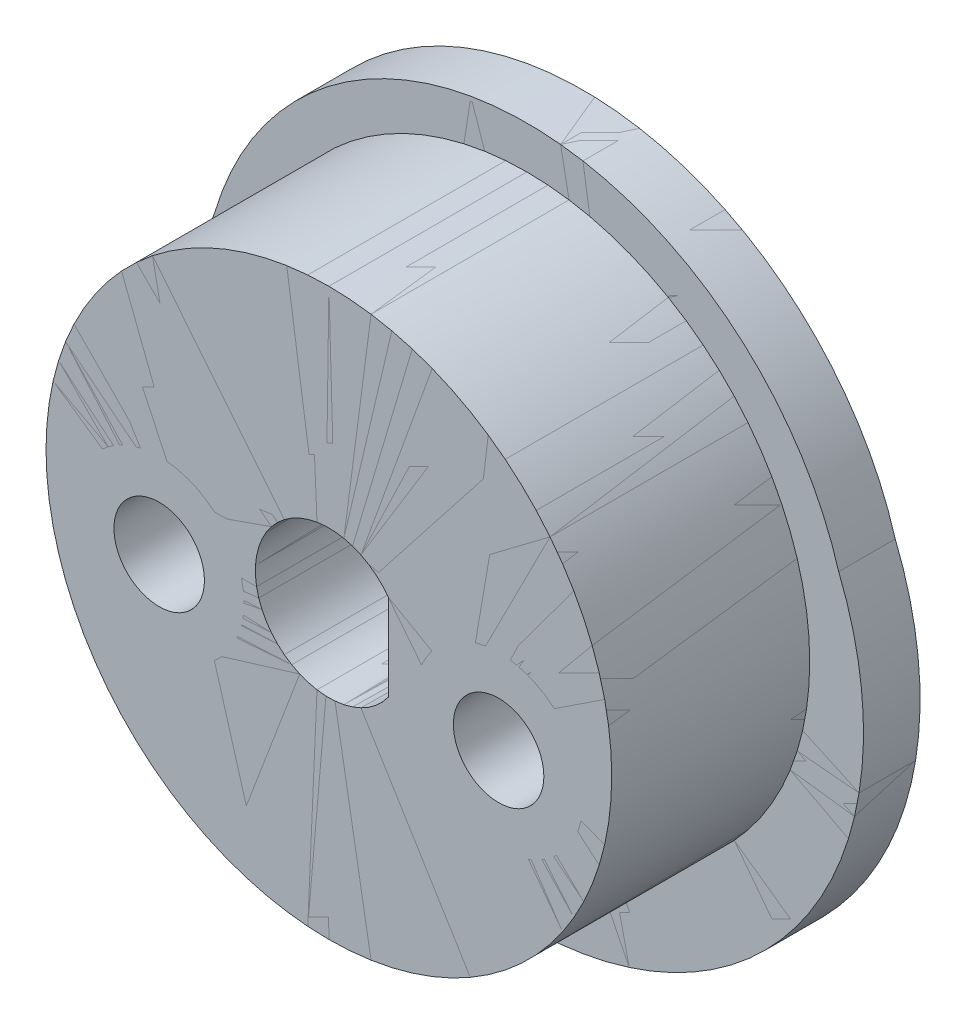
ISO-10303-21;
HEADER;
FILE_DESCRIPTION(('STEP AP214'),'2;1');
FILE_NAME('part.step','',(''),(''),'','','');
FILE_SCHEMA(('AUTOMOTIVE_DESIGN { 1 0 10303 214 1 1 1 1 }'));
ENDSEC;
DATA;
#1=APPLICATION_CONTEXT('core data for automotive mechanical design processes');
#2=APPLICATION_PROTOCOL_DEFINITION('international standard','automotive_design',2000,#1);
#3=PRODUCT_CONTEXT('',#1,'mechanical');
#4=PRODUCT('Part','Part','',(#3));
#5=PRODUCT_RELATED_PRODUCT_CATEGORY('part','',(#4));
#6=PRODUCT_DEFINITION_FORMATION('','',#4);
#7=PRODUCT_DEFINITION_CONTEXT('part definition',#1,'design');
#8=PRODUCT_DEFINITION('design','',#6,#7);
#9=PRODUCT_DEFINITION_SHAPE('','',#8);
#10=(LENGTH_UNIT() NAMED_UNIT(*) SI_UNIT(.MILLI.,.METRE.));
#11=(NAMED_UNIT(*) PLANE_ANGLE_UNIT() SI_UNIT($,.RADIAN.));
#12=(NAMED_UNIT(*) SI_UNIT($,.STERADIAN.) SOLID_ANGLE_UNIT());
#13=UNCERTAINTY_MEASURE_WITH_UNIT(LENGTH_MEASURE(1.E-05),#10,'distance_accuracy_value','');
#14=(GEOMETRIC_REPRESENTATION_CONTEXT(3) GLOBAL_UNCERTAINTY_ASSIGNED_CONTEXT((#13)) GLOBAL_UNIT_ASSIGNED_CONTEXT((#10,
#11,#12)) REPRESENTATION_CONTEXT('',''));
#15=CARTESIAN_POINT('',(0.,0.,0.));
#16=DIRECTION('',(0.,0.,1.));
#17=DIRECTION('',(1.,0.,0.));
#18=AXIS2_PLACEMENT_3D('',#15,#16,#17);
#19=CARTESIAN_POINT('',(0.,0.,18.));
#20=DIRECTION('',(0.,0.,1.));
#21=DIRECTION('',(1.,0.,0.));
#22=AXIS2_PLACEMENT_3D('',#19,#20,#21);
#23=PLANE('',#22);
#24=CARTESIAN_POINT('',(6.,-1.21,18.));
#25=DIRECTION('',(0.,0.,1.));
#26=DIRECTION('',(1.,0.,0.));
#27=AXIS2_PLACEMENT_3D('',#24,#25,#26);
#28=CIRCLE('',#27,3.);
#29=CARTESIAN_POINT('',(9.,-1.21,18.));
#30=VERTEX_POINT('',#29);
#31=EDGE_CURVE('P0_E60',#30,#30,#28,.F.);
#32=ORIENTED_EDGE('',*,*,#31,.T.);
#33=EDGE_LOOP('',(#32));
#34=FACE_BOUND('',#33,.T.);
#35=CARTESIAN_POINT('',(-6.,-1.21,18.));
#36=DIRECTION('',(0.,0.,1.));
#37=DIRECTION('',(1.,0.,0.));
#38=AXIS2_PLACEMENT_3D('',#35,#36,#37);
#39=CIRCLE('',#38,3.);
#40=CARTESIAN_POINT('',(-3.,-1.21,18.));
#41=VERTEX_POINT('',#40);
#42=EDGE_CURVE('P0_E140',#41,#41,#39,.F.);
#43=ORIENTED_EDGE('',*,*,#42,.T.);
#44=EDGE_LOOP('',(#43));
#45=FACE_BOUND('',#44,.T.);
#46=CARTESIAN_POINT('',(-1.59872115546023E-13,-2.8421709430404E-13,18.));
#47=DIRECTION('',(0.,0.,-1.));
#48=DIRECTION('',(-1.,0.,0.));
#49=AXIS2_PLACEMENT_3D('',#46,#47,#48);
#50=CIRCLE('',#49,2.6);
#51=CARTESIAN_POINT('',(2.09999999999983,-1.53297097167589,18.));
#52=VERTEX_POINT('',#51);
#53=CARTESIAN_POINT('',(2.09999999999983,1.53297097167532,18.));
#54=VERTEX_POINT('',#53);
#55=EDGE_CURVE('P0_E105',#52,#54,#50,.T.);
#56=ORIENTED_EDGE('',*,*,#55,.T.);
#57=DIRECTION('',(0.,1.,0.));
#58=VECTOR('',#57,1.);
#59=CARTESIAN_POINT('',(2.09999999999983,0.,18.));
#60=LINE('',#59,#58);
#61=EDGE_CURVE('P0_E112',#54,#52,#60,.F.);
#62=ORIENTED_EDGE('',*,*,#61,.T.);
#63=EDGE_LOOP('',(#56,#62));
#64=FACE_BOUND('',#63,.T.);
#65=CARTESIAN_POINT('',(0.,0.,18.));
#66=DIRECTION('',(0.,0.,1.));
#67=DIRECTION('',(-1.,0.,0.));
#68=AXIS2_PLACEMENT_3D('',#65,#66,#67);
#69=CIRCLE('',#68,10.);
#70=CARTESIAN_POINT('',(10.,0.,18.));
#71=VERTEX_POINT('',#70);
#72=EDGE_CURVE('P0_E176',#71,#71,#69,.T.);
#73=ORIENTED_EDGE('',*,*,#72,.T.);
#74=EDGE_LOOP('',(#73));
#75=FACE_BOUND('',#74,.T.);
#76=ADVANCED_FACE('P0_F49',(#34,#45,#64,#75),#23,.T.);
#77=CARTESIAN_POINT('',(0.,0.,11.));
#78=DIRECTION('',(0.,0.,1.));
#79=DIRECTION('',(-1.,0.,0.));
#80=AXIS2_PLACEMENT_3D('',#77,#78,#79);
#81=CYLINDRICAL_SURFACE('',#80,10.);
#82=ORIENTED_EDGE('',*,*,#72,.F.);
#83=DIRECTION('',(0.,0.,-1.));
#84=VECTOR('',#83,1.);
#85=CARTESIAN_POINT('',(10.,0.,11.));
#86=LINE('',#85,#84);
#87=CARTESIAN_POINT('',(10.,0.,11.));
#88=VERTEX_POINT('',#87);
#89=EDGE_CURVE('P0_E72',#71,#88,#86,.T.);
#90=ORIENTED_EDGE('',*,*,#89,.T.);
#91=CARTESIAN_POINT('',(0.,0.,11.));
#92=DIRECTION('',(0.,0.,-1.));
#93=DIRECTION('',(-1.,0.,0.));
#94=AXIS2_PLACEMENT_3D('',#91,#92,#93);
#95=CIRCLE('',#94,10.);
#96=EDGE_CURVE('P0_E187',#88,#88,#95,.T.);
#97=ORIENTED_EDGE('',*,*,#96,.F.);
#98=ORIENTED_EDGE('',*,*,#89,.F.);
#99=EDGE_LOOP('',(#82,#90,#97,#98));
#100=FACE_BOUND('',#99,.T.);
#101=ADVANCED_FACE('P0_F220',(#100),#81,.T.);
#102=CARTESIAN_POINT('',(0.,0.,9.));
#103=DIRECTION('',(0.,0.,1.));
#104=DIRECTION('',(1.,0.,0.));
#105=AXIS2_PLACEMENT_3D('',#102,#103,#104);
#106=PLANE('',#105);
#107=CARTESIAN_POINT('',(-6.,-1.21,9.));
#108=DIRECTION('',(0.,0.,1.));
#109=DIRECTION('',(1.,0.,0.));
#110=AXIS2_PLACEMENT_3D('',#107,#108,#109);
#111=CIRCLE('',#110,2.);
#112=CARTESIAN_POINT('',(-4.,-1.21,9.));
#113=VERTEX_POINT('',#112);
#114=EDGE_CURVE('P0_E166',#113,#113,#111,.T.);
#115=ORIENTED_EDGE('',*,*,#114,.T.);
#116=EDGE_LOOP('',(#115));
#117=FACE_BOUND('',#116,.T.);
#118=CARTESIAN_POINT('',(6.,-1.21,9.));
#119=DIRECTION('',(0.,0.,1.));
#120=DIRECTION('',(1.,0.,0.));
#121=AXIS2_PLACEMENT_3D('',#118,#119,#120);
#122=CIRCLE('',#121,2.);
#123=CARTESIAN_POINT('',(8.,-1.21,9.));
#124=VERTEX_POINT('',#123);
#125=EDGE_CURVE('P0_E163',#124,#124,#122,.T.);
#126=ORIENTED_EDGE('',*,*,#125,.T.);
#127=EDGE_LOOP('',(#126));
#128=FACE_BOUND('',#127,.T.);
#129=CARTESIAN_POINT('',(-1.5487611193521E-13,-2.81469292318093E-13,9.));
#130=DIRECTION('',(0.,0.,1.));
#131=DIRECTION('',(-1.,0.,0.));
#132=AXIS2_PLACEMENT_3D('',#129,#130,#131);
#133=CIRCLE('',#132,2.6);
#134=CARTESIAN_POINT('',(2.09999999999984,1.53297097167533,9.));
#135=VERTEX_POINT('',#134);
#136=CARTESIAN_POINT('',(2.09999999999984,-1.5329709716759,9.));
#137=VERTEX_POINT('',#136);
#138=EDGE_CURVE('P0_E116',#135,#137,#133,.T.);
#139=ORIENTED_EDGE('',*,*,#138,.T.);
#140=DIRECTION('',(0.,1.,0.));
#141=VECTOR('',#140,1.);
#142=CARTESIAN_POINT('',(2.09999999999984,0.766485485837665,9.));
#143=LINE('',#142,#141);
#144=EDGE_CURVE('P0_E133',#137,#135,#143,.T.);
#145=ORIENTED_EDGE('',*,*,#144,.T.);
#146=EDGE_LOOP('',(#139,#145));
#147=FACE_BOUND('',#146,.T.);
#148=CARTESIAN_POINT('',(0.,0.,9.));
#149=DIRECTION('',(0.,0.,-1.));
#150=DIRECTION('',(-1.,0.,0.));
#151=AXIS2_PLACEMENT_3D('',#148,#149,#150);
#152=CIRCLE('',#151,11.5);
#153=CARTESIAN_POINT('',(-11.0242322682793,3.27357646848657,9.));
#154=VERTEX_POINT('',#153);
#155=CARTESIAN_POINT('',(11.0242322682793,3.27357646848657,9.));
#156=VERTEX_POINT('',#155);
#157=EDGE_CURVE('P0_E179',#154,#156,#152,.T.);
#158=ORIENTED_EDGE('',*,*,#157,.T.);
#159=CARTESIAN_POINT('',(0.,-1.21,9.));
#160=DIRECTION('',(0.,0.,1.));
#161=DIRECTION('',(-1.,0.,0.));
#162=AXIS2_PLACEMENT_3D('',#159,#160,#161);
#163=CIRCLE('',#162,11.9010989010989);
#164=EDGE_CURVE('P0_E175',#154,#156,#163,.T.);
#165=ORIENTED_EDGE('',*,*,#164,.F.);
#166=EDGE_LOOP('',(#158,#165));
#167=FACE_BOUND('',#166,.T.);
#168=ADVANCED_FACE('P0_F218',(#117,#128,#147,#167),#106,.F.);
#169=CARTESIAN_POINT('',(0.,0.,9.));
#170=DIRECTION('',(0.,0.,1.));
#171=DIRECTION('',(-1.,0.,0.));
#172=AXIS2_PLACEMENT_3D('',#169,#170,#171);
#173=CYLINDRICAL_SURFACE('',#172,11.5);
#174=DIRECTION('',(0.,0.,1.));
#175=VECTOR('',#174,1.);
#176=CARTESIAN_POINT('',(-11.0242322682793,3.27357646848657,9.));
#177=LINE('',#176,#175);
#178=CARTESIAN_POINT('',(-11.0242322682793,3.27357646848657,11.));
#179=VERTEX_POINT('',#178);
#180=EDGE_CURVE('P0_E115',#154,#179,#177,.T.);
#181=ORIENTED_EDGE('',*,*,#180,.T.);
#182=CARTESIAN_POINT('',(0.,0.,11.));
#183=DIRECTION('',(0.,0.,1.));
#184=DIRECTION('',(-1.,0.,0.));
#185=AXIS2_PLACEMENT_3D('',#182,#183,#184);
#186=CIRCLE('',#185,11.5);
#187=CARTESIAN_POINT('',(11.0242322682793,3.27357646848657,11.));
#188=VERTEX_POINT('',#187);
#189=EDGE_CURVE('P0_E188',#188,#179,#186,.T.);
#190=ORIENTED_EDGE('',*,*,#189,.F.);
#191=DIRECTION('',(0.,0.,-1.));
#192=VECTOR('',#191,1.);
#193=CARTESIAN_POINT('',(11.0242322682793,3.27357646848657,9.));
#194=LINE('',#193,#192);
#195=EDGE_CURVE('P0_E183',#188,#156,#194,.T.);
#196=ORIENTED_EDGE('',*,*,#195,.T.);
#197=ORIENTED_EDGE('',*,*,#157,.F.);
#198=EDGE_LOOP('',(#181,#190,#196,#197));
#199=FACE_BOUND('',#198,.T.);
#200=ADVANCED_FACE('P0_F214',(#199),#173,.T.);
#201=CARTESIAN_POINT('',(0.,0.,11.));
#202=DIRECTION('',(0.,0.,1.));
#203=DIRECTION('',(1.,0.,0.));
#204=AXIS2_PLACEMENT_3D('',#201,#202,#203);
#205=PLANE('',#204);
#206=ORIENTED_EDGE('',*,*,#96,.T.);
#207=EDGE_LOOP('',(#206));
#208=FACE_BOUND('',#207,.T.);
#209=ORIENTED_EDGE('',*,*,#189,.T.);
#210=CARTESIAN_POINT('',(0.,-1.21,11.));
#211=DIRECTION('',(0.,0.,1.));
#212=DIRECTION('',(-1.,0.,0.));
#213=AXIS2_PLACEMENT_3D('',#210,#211,#212);
#214=CIRCLE('',#213,11.9010989010989);
#215=EDGE_CURVE('P0_E192',#179,#188,#214,.T.);
#216=ORIENTED_EDGE('',*,*,#215,.T.);
#217=EDGE_LOOP('',(#209,#216));
#218=FACE_BOUND('',#217,.T.);
#219=ADVANCED_FACE('P0_F208',(#208,#218),#205,.T.);
#220=CARTESIAN_POINT('',(0.,-1.21,9.));
#221=DIRECTION('',(0.,0.,1.));
#222=DIRECTION('',(0.,-1.,0.));
#223=AXIS2_PLACEMENT_3D('',#220,#221,#222);
#224=CYLINDRICAL_SURFACE('',#223,11.9010989010989);
#225=ORIENTED_EDGE('',*,*,#180,.F.);
#226=ORIENTED_EDGE('',*,*,#164,.T.);
#227=ORIENTED_EDGE('',*,*,#195,.F.);
#228=ORIENTED_EDGE('',*,*,#215,.F.);
#229=EDGE_LOOP('',(#225,#226,#227,#228));
#230=FACE_BOUND('',#229,.T.);
#231=ADVANCED_FACE('P0_F211',(#230),#224,.T.);
#232=CARTESIAN_POINT('',(-1.59872115546023E-13,-2.8421709430404E-13,17.9999999999996));
#233=DIRECTION('',(0.,0.,-1.));
#234=DIRECTION('',(-1.,0.,0.));
#235=AXIS2_PLACEMENT_3D('',#232,#233,#234);
#236=CYLINDRICAL_SURFACE('',#235,2.6);
#237=ORIENTED_EDGE('',*,*,#138,.F.);
#238=DIRECTION('',(0.,0.,-1.));
#239=VECTOR('',#238,1.);
#240=CARTESIAN_POINT('',(2.09999999999983,1.53297097167533,17.9999999999996));
#241=LINE('',#240,#239);
#242=EDGE_CURVE('P0_E119',#54,#135,#241,.T.);
#243=ORIENTED_EDGE('',*,*,#242,.F.);
#244=ORIENTED_EDGE('',*,*,#55,.F.);
#245=DIRECTION('',(0.,0.,-1.));
#246=VECTOR('',#245,1.);
#247=CARTESIAN_POINT('',(2.09999999999983,-1.5329709716759,17.9999999999996));
#248=LINE('',#247,#246);
#249=EDGE_CURVE('P0_E127',#52,#137,#248,.T.);
#250=ORIENTED_EDGE('',*,*,#249,.T.);
#251=EDGE_LOOP('',(#237,#243,#244,#250));
#252=FACE_BOUND('',#251,.T.);
#253=ADVANCED_FACE('P0_F120',(#252),#236,.F.);
#254=CARTESIAN_POINT('',(2.09999999999983,1.53297097167533,17.9999999999996));
#255=DIRECTION('',(1.,0.,0.));
#256=DIRECTION('',(0.,0.,1.));
#257=AXIS2_PLACEMENT_3D('',#254,#255,#256);
#258=PLANE('',#257);
#259=ORIENTED_EDGE('',*,*,#144,.F.);
#260=ORIENTED_EDGE('',*,*,#249,.F.);
#261=ORIENTED_EDGE('',*,*,#61,.F.);
#262=ORIENTED_EDGE('',*,*,#242,.T.);
#263=EDGE_LOOP('',(#259,#260,#261,#262));
#264=FACE_BOUND('',#263,.T.);
#265=ADVANCED_FACE('P0_F126',(#264),#258,.F.);
#266=CARTESIAN_POINT('',(6.,-1.21,9.));
#267=DIRECTION('',(0.,0.,1.));
#268=DIRECTION('',(1.,0.,0.));
#269=AXIS2_PLACEMENT_3D('',#266,#267,#268);
#270=CYLINDRICAL_SURFACE('',#269,2.);
#271=CARTESIAN_POINT('',(6.,-1.21,17.));
#272=DIRECTION('',(0.,0.,1.));
#273=DIRECTION('',(1.,0.,0.));
#274=AXIS2_PLACEMENT_3D('',#271,#272,#273);
#275=CIRCLE('',#274,2.);
#276=CARTESIAN_POINT('',(8.,-1.21,17.));
#277=VERTEX_POINT('',#276);
#278=EDGE_CURVE('P0_E136',#277,#277,#275,.T.);
#279=ORIENTED_EDGE('',*,*,#278,.T.);
#280=EDGE_LOOP('',(#279));
#281=FACE_BOUND('',#280,.T.);
#282=ORIENTED_EDGE('',*,*,#125,.F.);
#283=EDGE_LOOP('',(#282));
#284=FACE_BOUND('',#283,.T.);
#285=ADVANCED_FACE('P0_F157',(#281,#284),#270,.F.);
#286=CARTESIAN_POINT('',(-6.,-1.21,9.));
#287=DIRECTION('',(0.,0.,1.));
#288=DIRECTION('',(1.,0.,0.));
#289=AXIS2_PLACEMENT_3D('',#286,#287,#288);
#290=CYLINDRICAL_SURFACE('',#289,2.);
#291=CARTESIAN_POINT('',(-6.,-1.21,17.));
#292=DIRECTION('',(0.,0.,1.));
#293=DIRECTION('',(1.,0.,0.));
#294=AXIS2_PLACEMENT_3D('',#291,#292,#293);
#295=CIRCLE('',#294,2.);
#296=CARTESIAN_POINT('',(-4.,-1.21,17.));
#297=VERTEX_POINT('',#296);
#298=EDGE_CURVE('P0_E11',#297,#297,#295,.T.);
#299=ORIENTED_EDGE('',*,*,#298,.T.);
#300=EDGE_LOOP('',(#299));
#301=FACE_BOUND('',#300,.T.);
#302=ORIENTED_EDGE('',*,*,#114,.F.);
#303=EDGE_LOOP('',(#302));
#304=FACE_BOUND('',#303,.T.);
#305=ADVANCED_FACE('P0_F154',(#301,#304),#290,.F.);
#306=CARTESIAN_POINT('',(6.,-1.21,17.));
#307=DIRECTION('',(0.,0.,1.));
#308=DIRECTION('',(1.,0.,0.));
#309=AXIS2_PLACEMENT_3D('',#306,#307,#308);
#310=CONICAL_SURFACE('',#309,2.,0.785398163397449);
#311=ORIENTED_EDGE('',*,*,#31,.F.);
#312=EDGE_LOOP('',(#311));
#313=FACE_BOUND('',#312,.T.);
#314=ORIENTED_EDGE('',*,*,#278,.F.);
#315=EDGE_LOOP('',(#314));
#316=FACE_BOUND('',#315,.T.);
#317=ADVANCED_FACE('P0_F151',(#313,#316),#310,.F.);
#318=CARTESIAN_POINT('',(-6.,-1.21,17.));
#319=DIRECTION('',(0.,0.,1.));
#320=DIRECTION('',(1.,0.,0.));
#321=AXIS2_PLACEMENT_3D('',#318,#319,#320);
#322=CONICAL_SURFACE('',#321,2.,0.785398163397451);
#323=ORIENTED_EDGE('',*,*,#42,.F.);
#324=EDGE_LOOP('',(#323));
#325=FACE_BOUND('',#324,.T.);
#326=ORIENTED_EDGE('',*,*,#298,.F.);
#327=EDGE_LOOP('',(#326));
#328=FACE_BOUND('',#327,.T.);
#329=ADVANCED_FACE('P0_F52',(#325,#328),#322,.F.);
#330=CLOSED_SHELL('',(#76,#101,#168,#200,#219,#231,#253,#265,#285,#305,#317,#329));
#331=MANIFOLD_SOLID_BREP('P0_B2',#330);
#332=CARTESIAN_POINT('',(0.,0.,18.));
#333=DIRECTION('',(0.,0.,1.));
#334=DIRECTION('',(1.,0.,0.));
#335=AXIS2_PLACEMENT_3D('',#332,#333,#334);
#336=PLANE('',#335);
#337=CARTESIAN_POINT('',(-6.,-1.21,18.));
#338=DIRECTION('',(0.,0.,-1.));
#339=DIRECTION('',(-1.,0.,0.));
#340=AXIS2_PLACEMENT_3D('',#337,#338,#339);
#341=CIRCLE('',#340,1.6);
#342=CARTESIAN_POINT('',(-4.4,-1.21,18.));
#343=VERTEX_POINT('',#342);
#344=EDGE_CURVE('P1_E20',#343,#343,#341,.T.);
#345=ORIENTED_EDGE('',*,*,#344,.T.);
#346=EDGE_LOOP('',(#345));
#347=FACE_BOUND('',#346,.T.);
#348=CARTESIAN_POINT('',(6.,-1.21,18.));
#349=DIRECTION('',(0.,0.,-1.));
#350=DIRECTION('',(-1.,0.,0.));
#351=AXIS2_PLACEMENT_3D('',#348,#349,#350);
#352=CIRCLE('',#351,1.6);
#353=CARTESIAN_POINT('',(7.6,-1.21,18.));
#354=VERTEX_POINT('',#353);
#355=EDGE_CURVE('P1_E152',#354,#354,#352,.T.);
#356=ORIENTED_EDGE('',*,*,#355,.T.);
#357=EDGE_LOOP('',(#356));
#358=FACE_BOUND('',#357,.T.);
#359=CARTESIAN_POINT('',(-1.59872115546023E-13,-2.8421709430404E-13,18.));
#360=DIRECTION('',(0.,0.,-1.));
#361=DIRECTION('',(-1.,0.,0.));
#362=AXIS2_PLACEMENT_3D('',#359,#360,#361);
#363=CIRCLE('',#362,2.6);
#364=CARTESIAN_POINT('',(2.09999999999983,-1.5329709716759,17.9999999999996));
#365=VERTEX_POINT('',#364);
#366=CARTESIAN_POINT('',(2.09999999999983,1.53297097167533,17.9999999999996));
#367=VERTEX_POINT('',#366);
#368=EDGE_CURVE('P1_E99',#365,#367,#363,.T.);
#369=ORIENTED_EDGE('',*,*,#368,.T.);
#370=DIRECTION('',(0.,-1.,0.));
#371=VECTOR('',#370,1.);
#372=CARTESIAN_POINT('',(2.09999999999983,0.766485485837665,18.));
#373=LINE('',#372,#371);
#374=EDGE_CURVE('P1_E113',#367,#365,#373,.T.);
#375=ORIENTED_EDGE('',*,*,#374,.T.);
#376=EDGE_LOOP('',(#369,#375));
#377=FACE_BOUND('',#376,.T.);
#378=CARTESIAN_POINT('',(0.,0.,18.));
#379=DIRECTION('',(0.,0.,1.));
#380=DIRECTION('',(-1.,0.,0.));
#381=AXIS2_PLACEMENT_3D('',#378,#379,#380);
#382=CIRCLE('',#381,10.);
#383=CARTESIAN_POINT('',(10.,0.,18.));
#384=VERTEX_POINT('',#383);
#385=EDGE_CURVE('P1_E27',#384,#384,#382,.T.);
#386=ORIENTED_EDGE('',*,*,#385,.T.);
#387=EDGE_LOOP('',(#386));
#388=FACE_BOUND('',#387,.T.);
#389=ADVANCED_FACE('P1_F17',(#347,#358,#377,#388),#336,.T.);
#390=CARTESIAN_POINT('',(0.,0.,11.));
#391=DIRECTION('',(0.,0.,1.));
#392=DIRECTION('',(-1.,0.,0.));
#393=AXIS2_PLACEMENT_3D('',#390,#391,#392);
#394=CYLINDRICAL_SURFACE('',#393,10.);
#395=ORIENTED_EDGE('',*,*,#385,.F.);
#396=DIRECTION('',(0.,0.,-1.));
#397=VECTOR('',#396,1.);
#398=CARTESIAN_POINT('',(10.,0.,11.));
#399=LINE('',#398,#397);
#400=CARTESIAN_POINT('',(10.,0.,11.));
#401=VERTEX_POINT('',#400);
#402=EDGE_CURVE('P1_E11',#384,#401,#399,.T.);
#403=ORIENTED_EDGE('',*,*,#402,.T.);
#404=CARTESIAN_POINT('',(0.,0.,11.));
#405=DIRECTION('',(0.,0.,-1.));
#406=DIRECTION('',(-1.,0.,0.));
#407=AXIS2_PLACEMENT_3D('',#404,#405,#406);
#408=CIRCLE('',#407,10.);
#409=EDGE_CURVE('P1_E139',#401,#401,#408,.T.);
#410=ORIENTED_EDGE('',*,*,#409,.F.);
#411=ORIENTED_EDGE('',*,*,#402,.F.);
#412=EDGE_LOOP('',(#395,#403,#410,#411));
#413=FACE_BOUND('',#412,.T.);
#414=ADVANCED_FACE('P1_F204',(#413),#394,.T.);
#415=CARTESIAN_POINT('',(0.,0.,9.));
#416=DIRECTION('',(0.,0.,1.));
#417=DIRECTION('',(1.,0.,0.));
#418=AXIS2_PLACEMENT_3D('',#415,#416,#417);
#419=PLANE('',#418);
#420=CARTESIAN_POINT('',(-6.,-1.21,9.));
#421=DIRECTION('',(0.,0.,1.));
#422=DIRECTION('',(-1.,0.,0.));
#423=AXIS2_PLACEMENT_3D('',#420,#421,#422);
#424=CIRCLE('',#423,1.6);
#425=CARTESIAN_POINT('',(-4.4,-1.21,9.));
#426=VERTEX_POINT('',#425);
#427=EDGE_CURVE('P1_E157',#426,#426,#424,.T.);
#428=ORIENTED_EDGE('',*,*,#427,.T.);
#429=EDGE_LOOP('',(#428));
#430=FACE_BOUND('',#429,.T.);
#431=CARTESIAN_POINT('',(6.,-1.21,9.));
#432=DIRECTION('',(0.,0.,1.));
#433=DIRECTION('',(-1.,0.,0.));
#434=AXIS2_PLACEMENT_3D('',#431,#432,#433);
#435=CIRCLE('',#434,1.6);
#436=CARTESIAN_POINT('',(7.6,-1.21,9.));
#437=VERTEX_POINT('',#436);
#438=EDGE_CURVE('P1_E110',#437,#437,#435,.T.);
#439=ORIENTED_EDGE('',*,*,#438,.T.);
#440=EDGE_LOOP('',(#439));
#441=FACE_BOUND('',#440,.T.);
#442=CARTESIAN_POINT('',(-1.5487611193521E-13,-2.81469292318093E-13,9.));
#443=DIRECTION('',(0.,0.,1.));
#444=DIRECTION('',(-1.,0.,0.));
#445=AXIS2_PLACEMENT_3D('',#442,#443,#444);
#446=CIRCLE('',#445,2.6);
#447=CARTESIAN_POINT('',(2.09999999999984,1.53297097167533,9.));
#448=VERTEX_POINT('',#447);
#449=CARTESIAN_POINT('',(2.09999999999984,-1.5329709716759,9.));
#450=VERTEX_POINT('',#449);
#451=EDGE_CURVE('P1_E111',#448,#450,#446,.T.);
#452=ORIENTED_EDGE('',*,*,#451,.T.);
#453=DIRECTION('',(0.,1.,0.));
#454=VECTOR('',#453,1.);
#455=CARTESIAN_POINT('',(2.09999999999984,0.766485485837665,9.));
#456=LINE('',#455,#454);
#457=EDGE_CURVE('P1_E120',#450,#448,#456,.T.);
#458=ORIENTED_EDGE('',*,*,#457,.T.);
#459=EDGE_LOOP('',(#452,#458));
#460=FACE_BOUND('',#459,.T.);
#461=CARTESIAN_POINT('',(0.,0.,9.));
#462=DIRECTION('',(0.,0.,-1.));
#463=DIRECTION('',(-1.,0.,0.));
#464=AXIS2_PLACEMENT_3D('',#461,#462,#463);
#465=CIRCLE('',#464,11.5);
#466=CARTESIAN_POINT('',(-11.0242322682793,3.27357646848657,9.));
#467=VERTEX_POINT('',#466);
#468=CARTESIAN_POINT('',(11.0242322682793,3.27357646848657,9.));
#469=VERTEX_POINT('',#468);
#470=EDGE_CURVE('P1_E91',#467,#469,#465,.T.);
#471=ORIENTED_EDGE('',*,*,#470,.T.);
#472=CARTESIAN_POINT('',(0.,-1.21,9.));
#473=DIRECTION('',(0.,0.,1.));
#474=DIRECTION('',(-1.,0.,0.));
#475=AXIS2_PLACEMENT_3D('',#472,#473,#474);
#476=CIRCLE('',#475,11.9010989010989);
#477=EDGE_CURVE('P1_E132',#467,#469,#476,.T.);
#478=ORIENTED_EDGE('',*,*,#477,.F.);
#479=EDGE_LOOP('',(#471,#478));
#480=FACE_BOUND('',#479,.T.);
#481=ADVANCED_FACE('P1_F174',(#430,#441,#460,#480),#419,.F.);
#482=CARTESIAN_POINT('',(0.,0.,9.));
#483=DIRECTION('',(0.,0.,1.));
#484=DIRECTION('',(-1.,0.,0.));
#485=AXIS2_PLACEMENT_3D('',#482,#483,#484);
#486=CYLINDRICAL_SURFACE('',#485,11.5);
#487=DIRECTION('',(0.,0.,1.));
#488=VECTOR('',#487,1.);
#489=CARTESIAN_POINT('',(-11.0242322682793,3.27357646848657,9.));
#490=LINE('',#489,#488);
#491=CARTESIAN_POINT('',(-11.0242322682793,3.27357646848657,11.));
#492=VERTEX_POINT('',#491);
#493=EDGE_CURVE('P1_E128',#467,#492,#490,.T.);
#494=ORIENTED_EDGE('',*,*,#493,.T.);
#495=CARTESIAN_POINT('',(0.,0.,11.));
#496=DIRECTION('',(0.,0.,1.));
#497=DIRECTION('',(-1.,0.,0.));
#498=AXIS2_PLACEMENT_3D('',#495,#496,#497);
#499=CIRCLE('',#498,11.5);
#500=CARTESIAN_POINT('',(11.0242322682793,3.27357646848657,11.));
#501=VERTEX_POINT('',#500);
#502=EDGE_CURVE('P1_E81',#501,#492,#499,.T.);
#503=ORIENTED_EDGE('',*,*,#502,.F.);
#504=DIRECTION('',(0.,0.,-1.));
#505=VECTOR('',#504,1.);
#506=CARTESIAN_POINT('',(11.0242322682793,3.27357646848657,9.));
#507=LINE('',#506,#505);
#508=EDGE_CURVE('P1_E136',#501,#469,#507,.T.);
#509=ORIENTED_EDGE('',*,*,#508,.T.);
#510=ORIENTED_EDGE('',*,*,#470,.F.);
#511=EDGE_LOOP('',(#494,#503,#509,#510));
#512=FACE_BOUND('',#511,.T.);
#513=ADVANCED_FACE('P1_F186',(#512),#486,.T.);
#514=CARTESIAN_POINT('',(0.,0.,11.));
#515=DIRECTION('',(0.,0.,1.));
#516=DIRECTION('',(1.,0.,0.));
#517=AXIS2_PLACEMENT_3D('',#514,#515,#516);
#518=PLANE('',#517);
#519=ORIENTED_EDGE('',*,*,#409,.T.);
#520=EDGE_LOOP('',(#519));
#521=FACE_BOUND('',#520,.T.);
#522=ORIENTED_EDGE('',*,*,#502,.T.);
#523=CARTESIAN_POINT('',(0.,-1.21,11.));
#524=DIRECTION('',(0.,0.,1.));
#525=DIRECTION('',(-1.,0.,0.));
#526=AXIS2_PLACEMENT_3D('',#523,#524,#525);
#527=CIRCLE('',#526,11.9010989010989);
#528=EDGE_CURVE('P1_E141',#492,#501,#527,.T.);
#529=ORIENTED_EDGE('',*,*,#528,.T.);
#530=EDGE_LOOP('',(#522,#529));
#531=FACE_BOUND('',#530,.T.);
#532=ADVANCED_FACE('P1_F192',(#521,#531),#518,.T.);
#533=CARTESIAN_POINT('',(0.,-1.21,9.));
#534=DIRECTION('',(0.,0.,1.));
#535=DIRECTION('',(0.,-1.,0.));
#536=AXIS2_PLACEMENT_3D('',#533,#534,#535);
#537=CYLINDRICAL_SURFACE('',#536,11.9010989010989);
#538=ORIENTED_EDGE('',*,*,#493,.F.);
#539=ORIENTED_EDGE('',*,*,#477,.T.);
#540=ORIENTED_EDGE('',*,*,#508,.F.);
#541=ORIENTED_EDGE('',*,*,#528,.F.);
#542=EDGE_LOOP('',(#538,#539,#540,#541));
#543=FACE_BOUND('',#542,.T.);
#544=ADVANCED_FACE('P1_F189',(#543),#537,.T.);
#545=CARTESIAN_POINT('',(-6.,-1.21,9.));
#546=DIRECTION('',(0.,0.,1.));
#547=DIRECTION('',(-1.,0.,0.));
#548=AXIS2_PLACEMENT_3D('',#545,#546,#547);
#549=CYLINDRICAL_SURFACE('',#548,1.6);
#550=ORIENTED_EDGE('',*,*,#427,.F.);
#551=DIRECTION('',(0.,0.,1.));
#552=VECTOR('',#551,1.);
#553=CARTESIAN_POINT('',(-4.4,-1.21,9.));
#554=LINE('',#553,#552);
#555=EDGE_CURVE('P1_E153',#426,#343,#554,.T.);
#556=ORIENTED_EDGE('',*,*,#555,.T.);
#557=ORIENTED_EDGE('',*,*,#344,.F.);
#558=ORIENTED_EDGE('',*,*,#555,.F.);
#559=EDGE_LOOP('',(#550,#556,#557,#558));
#560=FACE_BOUND('',#559,.T.);
#561=ADVANCED_FACE('P1_F178',(#560),#549,.F.);
#562=CARTESIAN_POINT('',(6.,-1.21,9.));
#563=DIRECTION('',(0.,0.,1.));
#564=DIRECTION('',(-1.,0.,0.));
#565=AXIS2_PLACEMENT_3D('',#562,#563,#564);
#566=CYLINDRICAL_SURFACE('',#565,1.6);
#567=ORIENTED_EDGE('',*,*,#438,.F.);
#568=DIRECTION('',(0.,0.,1.));
#569=VECTOR('',#568,1.);
#570=CARTESIAN_POINT('',(7.6,-1.21,9.));
#571=LINE('',#570,#569);
#572=EDGE_CURVE('P1_E146',#437,#354,#571,.T.);
#573=ORIENTED_EDGE('',*,*,#572,.T.);
#574=ORIENTED_EDGE('',*,*,#355,.F.);
#575=ORIENTED_EDGE('',*,*,#572,.F.);
#576=EDGE_LOOP('',(#567,#573,#574,#575));
#577=FACE_BOUND('',#576,.T.);
#578=ADVANCED_FACE('P1_F213',(#577),#566,.F.);
#579=CARTESIAN_POINT('',(-1.59872115546023E-13,-2.8421709430404E-13,17.9999999999996));
#580=DIRECTION('',(0.,0.,-1.));
#581=DIRECTION('',(-1.,0.,0.));
#582=AXIS2_PLACEMENT_3D('',#579,#580,#581);
#583=CYLINDRICAL_SURFACE('',#582,2.6);
#584=ORIENTED_EDGE('',*,*,#451,.F.);
#585=DIRECTION('',(0.,0.,-1.));
#586=VECTOR('',#585,1.);
#587=CARTESIAN_POINT('',(2.09999999999983,1.53297097167533,17.9999999999996));
#588=LINE('',#587,#586);
#589=EDGE_CURVE('P1_E106',#367,#448,#588,.T.);
#590=ORIENTED_EDGE('',*,*,#589,.F.);
#591=ORIENTED_EDGE('',*,*,#368,.F.);
#592=DIRECTION('',(0.,0.,-1.));
#593=VECTOR('',#592,1.);
#594=CARTESIAN_POINT('',(2.09999999999983,-1.5329709716759,17.9999999999996));
#595=LINE('',#594,#593);
#596=EDGE_CURVE('P1_E103',#365,#450,#595,.T.);
#597=ORIENTED_EDGE('',*,*,#596,.T.);
#598=EDGE_LOOP('',(#584,#590,#591,#597));
#599=FACE_BOUND('',#598,.T.);
#600=ADVANCED_FACE('P1_F101',(#599),#583,.F.);
#601=CARTESIAN_POINT('',(2.09999999999983,1.53297097167533,17.9999999999996));
#602=DIRECTION('',(1.,0.,0.));
#603=DIRECTION('',(0.,0.,1.));
#604=AXIS2_PLACEMENT_3D('',#601,#602,#603);
#605=PLANE('',#604);
#606=ORIENTED_EDGE('',*,*,#457,.F.);
#607=ORIENTED_EDGE('',*,*,#596,.F.);
#608=ORIENTED_EDGE('',*,*,#374,.F.);
#609=ORIENTED_EDGE('',*,*,#589,.T.);
#610=EDGE_LOOP('',(#606,#607,#608,#609));
#611=FACE_BOUND('',#610,.T.);
#612=ADVANCED_FACE('P1_F118',(#611),#605,.F.);
#613=CLOSED_SHELL('',(#389,#414,#481,#513,#532,#544,#561,#578,#600,#612));
#614=MANIFOLD_SOLID_BREP('P1_B1',#613);
#615=ADVANCED_BREP_SHAPE_REPRESENTATION('',(#18,#331,#614),#14);
#616=SHAPE_DEFINITION_REPRESENTATION(#9,#615);
ENDSEC;
END-ISO-10303-21;
